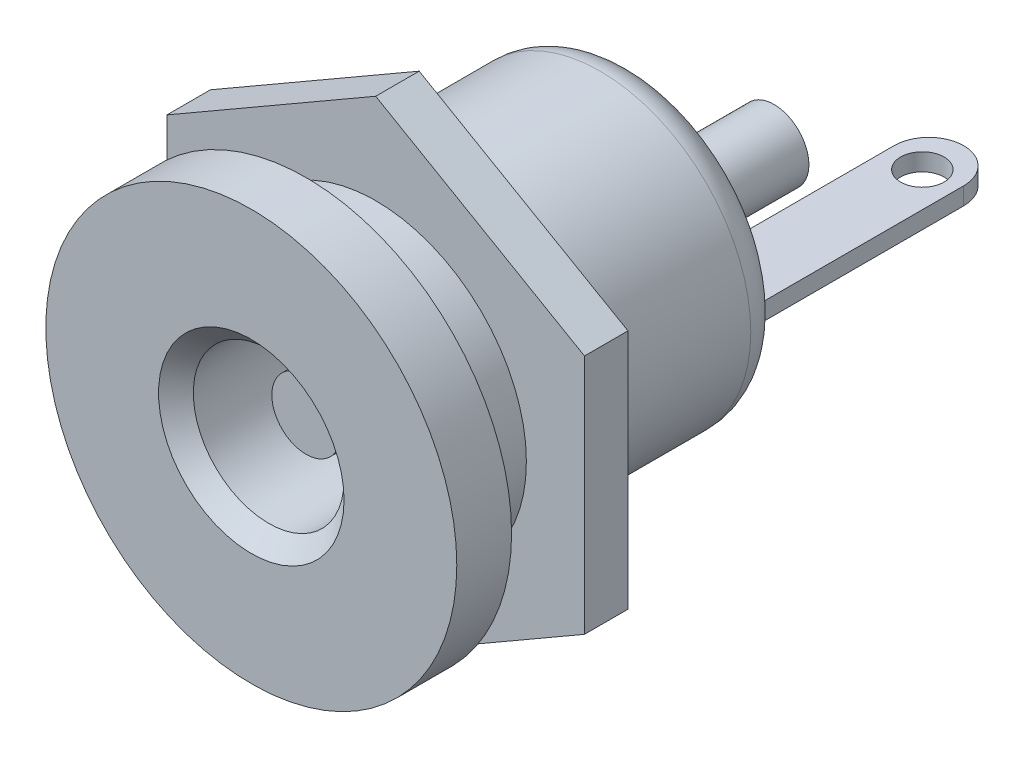
ISO-10303-21;
HEADER;
FILE_DESCRIPTION(('STEP AP214'),'2;1');
FILE_NAME('part.step','',(''),(''),'','','');
FILE_SCHEMA(('AUTOMOTIVE_DESIGN { 1 0 10303 214 1 1 1 1 }'));
ENDSEC;
DATA;
#1=APPLICATION_CONTEXT('core data for automotive mechanical design processes');
#2=APPLICATION_PROTOCOL_DEFINITION('international standard','automotive_design',2000,#1);
#3=PRODUCT_CONTEXT('',#1,'mechanical');
#4=PRODUCT('Part','Part','',(#3));
#5=PRODUCT_RELATED_PRODUCT_CATEGORY('part','',(#4));
#6=PRODUCT_DEFINITION_FORMATION('','',#4);
#7=PRODUCT_DEFINITION_CONTEXT('part definition',#1,'design');
#8=PRODUCT_DEFINITION('design','',#6,#7);
#9=PRODUCT_DEFINITION_SHAPE('','',#8);
#10=(LENGTH_UNIT() NAMED_UNIT(*) SI_UNIT(.MILLI.,.METRE.));
#11=(NAMED_UNIT(*) PLANE_ANGLE_UNIT() SI_UNIT($,.RADIAN.));
#12=(NAMED_UNIT(*) SI_UNIT($,.STERADIAN.) SOLID_ANGLE_UNIT());
#13=UNCERTAINTY_MEASURE_WITH_UNIT(LENGTH_MEASURE(1.E-05),#10,'distance_accuracy_value','');
#14=(GEOMETRIC_REPRESENTATION_CONTEXT(3) GLOBAL_UNCERTAINTY_ASSIGNED_CONTEXT((#13)) GLOBAL_UNIT_ASSIGNED_CONTEXT((#10,
#11,#12)) REPRESENTATION_CONTEXT('',''));
#15=CARTESIAN_POINT('',(0.,0.,0.));
#16=DIRECTION('',(0.,0.,1.));
#17=DIRECTION('',(1.,0.,0.));
#18=AXIS2_PLACEMENT_3D('',#15,#16,#17);
#19=CARTESIAN_POINT('',(0.,0.,2.));
#20=DIRECTION('',(0.,0.,1.));
#21=DIRECTION('',(1.,0.,0.));
#22=AXIS2_PLACEMENT_3D('',#19,#20,#21);
#23=PLANE('',#22);
#24=CARTESIAN_POINT('',(0.,0.,2.));
#25=DIRECTION('',(0.,0.,1.));
#26=DIRECTION('',(1.,0.,0.));
#27=AXIS2_PLACEMENT_3D('',#24,#25,#26);
#28=CIRCLE('',#27,3.38500000000001);
#29=CARTESIAN_POINT('',(3.38500000000001,0.,2.));
#30=VERTEX_POINT('',#29);
#31=EDGE_CURVE('E12',#30,#30,#28,.F.);
#32=ORIENTED_EDGE('',*,*,#31,.T.);
#33=EDGE_LOOP('',(#32));
#34=FACE_BOUND('',#33,.T.);
#35=CARTESIAN_POINT('',(0.,0.,2.));
#36=DIRECTION('',(0.,0.,1.));
#37=DIRECTION('',(1.,0.,0.));
#38=AXIS2_PLACEMENT_3D('',#35,#36,#37);
#39=CIRCLE('',#38,7.5);
#40=CARTESIAN_POINT('',(7.5,0.,2.));
#41=VERTEX_POINT('',#40);
#42=EDGE_CURVE('E272',#41,#41,#39,.T.);
#43=ORIENTED_EDGE('',*,*,#42,.T.);
#44=EDGE_LOOP('',(#43));
#45=FACE_BOUND('',#44,.T.);
#46=ADVANCED_FACE('F43',(#34,#45),#23,.T.);
#47=CARTESIAN_POINT('',(0.,0.,0.));
#48=DIRECTION('',(0.,0.,1.));
#49=DIRECTION('',(1.,0.,0.));
#50=AXIS2_PLACEMENT_3D('',#47,#48,#49);
#51=PLANE('',#50);
#52=CARTESIAN_POINT('',(0.,0.,0.));
#53=DIRECTION('',(0.,0.,-1.));
#54=DIRECTION('',(-1.,0.,0.));
#55=AXIS2_PLACEMENT_3D('',#52,#53,#54);
#56=CIRCLE('',#55,5.5);
#57=CARTESIAN_POINT('',(-5.5,0.,0.));
#58=VERTEX_POINT('',#57);
#59=EDGE_CURVE('E268',#58,#58,#56,.T.);
#60=ORIENTED_EDGE('',*,*,#59,.F.);
#61=EDGE_LOOP('',(#60));
#62=FACE_BOUND('',#61,.T.);
#63=CARTESIAN_POINT('',(0.,0.,0.));
#64=DIRECTION('',(0.,0.,1.));
#65=DIRECTION('',(1.,0.,0.));
#66=AXIS2_PLACEMENT_3D('',#63,#64,#65);
#67=CIRCLE('',#66,7.5);
#68=CARTESIAN_POINT('',(7.5,0.,0.));
#69=VERTEX_POINT('',#68);
#70=EDGE_CURVE('E262',#69,#69,#67,.T.);
#71=ORIENTED_EDGE('',*,*,#70,.F.);
#72=EDGE_LOOP('',(#71));
#73=FACE_BOUND('',#72,.T.);
#74=ADVANCED_FACE('F419',(#62,#73),#51,.F.);
#75=CARTESIAN_POINT('',(0.,0.,2.));
#76=DIRECTION('',(0.,0.,-1.));
#77=DIRECTION('',(-1.,0.,0.));
#78=AXIS2_PLACEMENT_3D('',#75,#76,#77);
#79=CYLINDRICAL_SURFACE('',#78,7.5);
#80=ORIENTED_EDGE('',*,*,#42,.F.);
#81=EDGE_LOOP('',(#80));
#82=FACE_BOUND('',#81,.T.);
#83=ORIENTED_EDGE('',*,*,#70,.T.);
#84=EDGE_LOOP('',(#83));
#85=FACE_BOUND('',#84,.T.);
#86=ADVANCED_FACE('F425',(#82,#85),#79,.T.);
#87=CARTESIAN_POINT('',(0.,0.,2.));
#88=DIRECTION('',(0.,0.,-1.));
#89=DIRECTION('',(-1.,0.,0.));
#90=AXIS2_PLACEMENT_3D('',#87,#88,#89);
#91=CYLINDRICAL_SURFACE('',#90,2.75);
#92=CARTESIAN_POINT('',(0.,0.,1.36499999999999));
#93=DIRECTION('',(0.,0.,1.));
#94=DIRECTION('',(1.,0.,0.));
#95=AXIS2_PLACEMENT_3D('',#92,#93,#94);
#96=CIRCLE('',#95,2.75);
#97=CARTESIAN_POINT('',(2.75,0.,1.36499999999999));
#98=VERTEX_POINT('',#97);
#99=EDGE_CURVE('E53',#98,#98,#96,.T.);
#100=ORIENTED_EDGE('',*,*,#99,.T.);
#101=EDGE_LOOP('',(#100));
#102=FACE_BOUND('',#101,.T.);
#103=CARTESIAN_POINT('',(0.,0.,-10.7));
#104=DIRECTION('',(0.,0.,1.));
#105=DIRECTION('',(1.,0.,0.));
#106=AXIS2_PLACEMENT_3D('',#103,#104,#105);
#107=CIRCLE('',#106,2.75);
#108=CARTESIAN_POINT('',(2.75,0.,-10.7));
#109=VERTEX_POINT('',#108);
#110=EDGE_CURVE('E177',#109,#109,#107,.T.);
#111=ORIENTED_EDGE('',*,*,#110,.F.);
#112=EDGE_LOOP('',(#111));
#113=FACE_BOUND('',#112,.T.);
#114=ADVANCED_FACE('F430',(#102,#113),#91,.F.);
#115=CARTESIAN_POINT('',(0.,0.,-12.));
#116=DIRECTION('',(0.,0.,1.));
#117=DIRECTION('',(1.,0.,0.));
#118=AXIS2_PLACEMENT_3D('',#115,#116,#117);
#119=CYLINDRICAL_SURFACE('',#118,5.5);
#120=CARTESIAN_POINT('',(0.,0.,-2.54));
#121=DIRECTION('',(0.,0.,1.));
#122=DIRECTION('',(1.,0.,0.));
#123=AXIS2_PLACEMENT_3D('',#120,#121,#122);
#124=CIRCLE('',#123,5.5);
#125=CARTESIAN_POINT('',(5.5,0.,-2.54));
#126=VERTEX_POINT('',#125);
#127=EDGE_CURVE('E211',#126,#126,#124,.T.);
#128=ORIENTED_EDGE('',*,*,#127,.T.);
#129=EDGE_LOOP('',(#128));
#130=FACE_BOUND('',#129,.T.);
#131=ORIENTED_EDGE('',*,*,#59,.T.);
#132=EDGE_LOOP('',(#131));
#133=FACE_BOUND('',#132,.T.);
#134=ADVANCED_FACE('F378',(#130,#133),#119,.T.);
#135=CARTESIAN_POINT('',(173740.878483019,100300.544143311,-4.1275));
#136=DIRECTION('',(0.5,-0.866025403784438,0.));
#137=DIRECTION('',(0.866025403784439,0.5,0.));
#138=AXIS2_PLACEMENT_3D('',#135,#136,#137);
#139=PLANE('',#138);
#140=DIRECTION('',(0.866025403784438,0.5,0.));
#141=VECTOR('',#140,1.);
#142=CARTESIAN_POINT('',(173740.878483019,100300.544143311,-2.54));
#143=LINE('',#142,#141);
#144=CARTESIAN_POINT('',(5.6843418860808E-11,-8.79881810243432,-2.54));
#145=VERTEX_POINT('',#144);
#146=CARTESIAN_POINT('',(7.61999999997443,-4.39940905124558,-2.54));
#147=VERTEX_POINT('',#146);
#148=EDGE_CURVE('E192',#145,#147,#143,.T.);
#149=ORIENTED_EDGE('',*,*,#148,.F.);
#150=DIRECTION('',(0.,0.,1.));
#151=VECTOR('',#150,1.);
#152=CARTESIAN_POINT('',(5.6843418860808E-11,-8.79881810243432,-4.1275));
#153=LINE('',#152,#151);
#154=CARTESIAN_POINT('',(5.6843418860808E-11,-8.79881810243432,-4.1275));
#155=VERTEX_POINT('',#154);
#156=EDGE_CURVE('E168',#155,#145,#153,.T.);
#157=ORIENTED_EDGE('',*,*,#156,.F.);
#158=DIRECTION('',(0.866025403784438,0.5,0.));
#159=VECTOR('',#158,1.);
#160=CARTESIAN_POINT('',(173740.878483019,100300.544143311,-4.1275));
#161=LINE('',#160,#159);
#162=CARTESIAN_POINT('',(7.61999999997443,-4.39940905124558,-4.1275));
#163=VERTEX_POINT('',#162);
#164=EDGE_CURVE('E160',#155,#163,#161,.T.);
#165=ORIENTED_EDGE('',*,*,#164,.T.);
#166=DIRECTION('',(0.,0.,1.));
#167=VECTOR('',#166,1.);
#168=CARTESIAN_POINT('',(7.61999999997443,-4.39940905124558,-4.1275));
#169=LINE('',#168,#167);
#170=EDGE_CURVE('E141',#163,#147,#169,.T.);
#171=ORIENTED_EDGE('',*,*,#170,.T.);
#172=EDGE_LOOP('',(#149,#157,#165,#171));
#173=FACE_BOUND('',#172,.T.);
#174=ADVANCED_FACE('F167',(#173),#139,.T.);
#175=CARTESIAN_POINT('',(426259.121516981,-246109.617370464,-4.1275));
#176=DIRECTION('',(-0.5,-0.866025403784439,0.));
#177=DIRECTION('',(0.866025403784439,-0.5,0.));
#178=AXIS2_PLACEMENT_3D('',#175,#176,#177);
#179=PLANE('',#178);
#180=DIRECTION('',(0.866025403784439,-0.5,0.));
#181=VECTOR('',#180,1.);
#182=CARTESIAN_POINT('',(426259.121516981,-246109.617370464,-2.54));
#183=LINE('',#182,#181);
#184=CARTESIAN_POINT('',(-7.61999999997443,-4.39940905118874,-2.54));
#185=VERTEX_POINT('',#184);
#186=EDGE_CURVE('E170',#185,#145,#183,.T.);
#187=ORIENTED_EDGE('',*,*,#186,.F.);
#188=DIRECTION('',(0.,0.,1.));
#189=VECTOR('',#188,1.);
#190=CARTESIAN_POINT('',(-7.61999999997443,-4.39940905118874,-4.1275));
#191=LINE('',#190,#189);
#192=CARTESIAN_POINT('',(-7.61999999997443,-4.39940905118874,-4.1275));
#193=VERTEX_POINT('',#192);
#194=EDGE_CURVE('E212',#193,#185,#191,.T.);
#195=ORIENTED_EDGE('',*,*,#194,.F.);
#196=DIRECTION('',(0.866025403784439,-0.5,0.));
#197=VECTOR('',#196,1.);
#198=CARTESIAN_POINT('',(426259.121516981,-246109.617370464,-4.1275));
#199=LINE('',#198,#197);
#200=EDGE_CURVE('E153',#193,#155,#199,.T.);
#201=ORIENTED_EDGE('',*,*,#200,.T.);
#202=ORIENTED_EDGE('',*,*,#156,.T.);
#203=EDGE_LOOP('',(#187,#195,#201,#202));
#204=FACE_BOUND('',#203,.T.);
#205=ADVANCED_FACE('F377',(#204),#179,.T.);
#206=CARTESIAN_POINT('',(-7.62000000003127,-291591.75,-4.1275));
#207=DIRECTION('',(-1.,0.,0.));
#208=DIRECTION('',(0.,-1.,0.));
#209=AXIS2_PLACEMENT_3D('',#206,#207,#208);
#210=PLANE('',#209);
#211=DIRECTION('',(0.,-1.,0.));
#212=VECTOR('',#211,1.);
#213=CARTESIAN_POINT('',(-7.62000000003127,-291591.75,-2.54));
#214=LINE('',#213,#212);
#215=CARTESIAN_POINT('',(-7.62000000000252,4.3994090511319,-2.54));
#216=VERTEX_POINT('',#215);
#217=EDGE_CURVE('E174',#216,#185,#214,.T.);
#218=ORIENTED_EDGE('',*,*,#217,.F.);
#219=DIRECTION('',(0.,0.,1.));
#220=VECTOR('',#219,1.);
#221=CARTESIAN_POINT('',(-7.62000000000252,4.3994090511319,-4.1275));
#222=LINE('',#221,#220);
#223=CARTESIAN_POINT('',(-7.62000000000252,4.3994090511319,-4.1275));
#224=VERTEX_POINT('',#223);
#225=EDGE_CURVE('E215',#224,#216,#222,.T.);
#226=ORIENTED_EDGE('',*,*,#225,.F.);
#227=DIRECTION('',(0.,-1.,0.));
#228=VECTOR('',#227,1.);
#229=CARTESIAN_POINT('',(-7.62000000003127,-291591.75,-4.1275));
#230=LINE('',#229,#228);
#231=EDGE_CURVE('E186',#224,#193,#230,.T.);
#232=ORIENTED_EDGE('',*,*,#231,.T.);
#233=ORIENTED_EDGE('',*,*,#194,.T.);
#234=EDGE_LOOP('',(#218,#226,#232,#233));
#235=FACE_BOUND('',#234,.T.);
#236=ADVANCED_FACE('F388',(#235),#210,.T.);
#237=CARTESIAN_POINT('',(173733.258483019,100313.742370465,-4.1275));
#238=DIRECTION('',(-0.5,0.866025403784439,0.));
#239=DIRECTION('',(-0.866025403784439,-0.5,0.));
#240=AXIS2_PLACEMENT_3D('',#237,#238,#239);
#241=PLANE('',#240);
#242=DIRECTION('',(-0.866025403784439,-0.5,0.));
#243=VECTOR('',#242,1.);
#244=CARTESIAN_POINT('',(173733.258483019,100313.742370465,-2.54));
#245=LINE('',#244,#243);
#246=CARTESIAN_POINT('',(-8.5265128291212E-11,8.79881810237748,-2.54));
#247=VERTEX_POINT('',#246);
#248=EDGE_CURVE('E202',#247,#216,#245,.T.);
#249=ORIENTED_EDGE('',*,*,#248,.F.);
#250=DIRECTION('',(0.,0.,1.));
#251=VECTOR('',#250,1.);
#252=CARTESIAN_POINT('',(-8.5265128291212E-11,8.79881810237748,-4.1275));
#253=LINE('',#252,#251);
#254=CARTESIAN_POINT('',(-8.5265128291212E-11,8.79881810237748,-4.1275));
#255=VERTEX_POINT('',#254);
#256=EDGE_CURVE('E218',#255,#247,#253,.T.);
#257=ORIENTED_EDGE('',*,*,#256,.F.);
#258=DIRECTION('',(-0.866025403784439,-0.5,0.));
#259=VECTOR('',#258,1.);
#260=CARTESIAN_POINT('',(173733.258483019,100313.742370465,-4.1275));
#261=LINE('',#260,#259);
#262=EDGE_CURVE('E182',#255,#224,#261,.T.);
#263=ORIENTED_EDGE('',*,*,#262,.T.);
#264=ORIENTED_EDGE('',*,*,#225,.T.);
#265=EDGE_LOOP('',(#249,#257,#263,#264));
#266=FACE_BOUND('',#265,.T.);
#267=ADVANCED_FACE('F384',(#266),#241,.T.);
#268=CARTESIAN_POINT('',(426266.741516981,-246096.419143311,-4.1275));
#269=DIRECTION('',(0.5,0.866025403784439,0.));
#270=DIRECTION('',(-0.866025403784439,0.5,0.));
#271=AXIS2_PLACEMENT_3D('',#268,#269,#270);
#272=PLANE('',#271);
#273=DIRECTION('',(-0.866025403784439,0.5,0.));
#274=VECTOR('',#273,1.);
#275=CARTESIAN_POINT('',(426266.741516981,-246096.419143311,-2.54));
#276=LINE('',#275,#274);
#277=CARTESIAN_POINT('',(7.61999999991758,4.39940905130243,-2.54));
#278=VERTEX_POINT('',#277);
#279=EDGE_CURVE('E198',#278,#247,#276,.T.);
#280=ORIENTED_EDGE('',*,*,#279,.F.);
#281=DIRECTION('',(0.,0.,1.));
#282=VECTOR('',#281,1.);
#283=CARTESIAN_POINT('',(7.61999999991758,4.39940905130243,-4.1275));
#284=LINE('',#283,#282);
#285=CARTESIAN_POINT('',(7.61999999991758,4.39940905130243,-4.1275));
#286=VERTEX_POINT('',#285);
#287=EDGE_CURVE('E152',#286,#278,#284,.T.);
#288=ORIENTED_EDGE('',*,*,#287,.F.);
#289=DIRECTION('',(-0.866025403784439,0.5,0.));
#290=VECTOR('',#289,1.);
#291=CARTESIAN_POINT('',(426266.741516981,-246096.419143311,-4.1275));
#292=LINE('',#291,#290);
#293=EDGE_CURVE('E164',#286,#255,#292,.T.);
#294=ORIENTED_EDGE('',*,*,#293,.T.);
#295=ORIENTED_EDGE('',*,*,#256,.T.);
#296=EDGE_LOOP('',(#280,#288,#294,#295));
#297=FACE_BOUND('',#296,.T.);
#298=ADVANCED_FACE('F381',(#297),#272,.T.);
#299=CARTESIAN_POINT('',(7.61999999997443,-291591.75,-4.1275));
#300=DIRECTION('',(1.,0.,0.));
#301=DIRECTION('',(0.,0.,-1.));
#302=AXIS2_PLACEMENT_3D('',#299,#300,#301);
#303=PLANE('',#302);
#304=DIRECTION('',(0.,1.,0.));
#305=VECTOR('',#304,1.);
#306=CARTESIAN_POINT('',(7.61999999997443,-291591.75,-2.54));
#307=LINE('',#306,#305);
#308=EDGE_CURVE('E146',#147,#278,#307,.T.);
#309=ORIENTED_EDGE('',*,*,#308,.F.);
#310=ORIENTED_EDGE('',*,*,#170,.F.);
#311=DIRECTION('',(0.,1.,0.));
#312=VECTOR('',#311,1.);
#313=CARTESIAN_POINT('',(7.61999999997443,-291591.75,-4.1275));
#314=LINE('',#313,#312);
#315=EDGE_CURVE('E144',#163,#286,#314,.T.);
#316=ORIENTED_EDGE('',*,*,#315,.T.);
#317=ORIENTED_EDGE('',*,*,#287,.T.);
#318=EDGE_LOOP('',(#309,#310,#316,#317));
#319=FACE_BOUND('',#318,.T.);
#320=ADVANCED_FACE('F143',(#319),#303,.T.);
#321=CARTESIAN_POINT('',(0.,0.,-4.1275));
#322=DIRECTION('',(0.,0.,1.));
#323=DIRECTION('',(1.,0.,0.));
#324=AXIS2_PLACEMENT_3D('',#321,#322,#323);
#325=PLANE('',#324);
#326=CARTESIAN_POINT('',(0.,0.,-4.1275));
#327=DIRECTION('',(0.,0.,1.));
#328=DIRECTION('',(1.,0.,0.));
#329=AXIS2_PLACEMENT_3D('',#326,#327,#328);
#330=CIRCLE('',#329,5.5);
#331=CARTESIAN_POINT('',(5.5,0.,-4.1275));
#332=VERTEX_POINT('',#331);
#333=EDGE_CURVE('E454',#332,#332,#330,.T.);
#334=ORIENTED_EDGE('',*,*,#333,.T.);
#335=EDGE_LOOP('',(#334));
#336=FACE_BOUND('',#335,.T.);
#337=ORIENTED_EDGE('',*,*,#164,.F.);
#338=ORIENTED_EDGE('',*,*,#200,.F.);
#339=ORIENTED_EDGE('',*,*,#231,.F.);
#340=ORIENTED_EDGE('',*,*,#262,.F.);
#341=ORIENTED_EDGE('',*,*,#293,.F.);
#342=ORIENTED_EDGE('',*,*,#315,.F.);
#343=EDGE_LOOP('',(#337,#338,#339,#340,#341,#342));
#344=FACE_BOUND('',#343,.T.);
#345=ADVANCED_FACE('F158',(#336,#344),#325,.F.);
#346=CARTESIAN_POINT('',(0.,0.,-2.54));
#347=DIRECTION('',(0.,0.,1.));
#348=DIRECTION('',(1.,0.,0.));
#349=AXIS2_PLACEMENT_3D('',#346,#347,#348);
#350=PLANE('',#349);
#351=ORIENTED_EDGE('',*,*,#127,.F.);
#352=EDGE_LOOP('',(#351));
#353=FACE_BOUND('',#352,.T.);
#354=ORIENTED_EDGE('',*,*,#148,.T.);
#355=ORIENTED_EDGE('',*,*,#308,.T.);
#356=ORIENTED_EDGE('',*,*,#279,.T.);
#357=ORIENTED_EDGE('',*,*,#248,.T.);
#358=ORIENTED_EDGE('',*,*,#217,.T.);
#359=ORIENTED_EDGE('',*,*,#186,.T.);
#360=EDGE_LOOP('',(#354,#355,#356,#357,#358,#359));
#361=FACE_BOUND('',#360,.T.);
#362=ADVANCED_FACE('F396',(#353,#361),#350,.T.);
#363=CARTESIAN_POINT('',(0.,0.,-17.08));
#364=DIRECTION('',(0.,0.,-1.));
#365=DIRECTION('',(-1.,0.,0.));
#366=AXIS2_PLACEMENT_3D('',#363,#364,#365);
#367=PLANE('',#366);
#368=CARTESIAN_POINT('',(0.,0.,-17.08));
#369=DIRECTION('',(0.,0.,-1.));
#370=DIRECTION('',(-1.,0.,0.));
#371=AXIS2_PLACEMENT_3D('',#368,#369,#370);
#372=CIRCLE('',#371,1.27);
#373=CARTESIAN_POINT('',(-1.27,0.,-17.08));
#374=VERTEX_POINT('',#373);
#375=EDGE_CURVE('E258',#374,#374,#372,.T.);
#376=ORIENTED_EDGE('',*,*,#375,.T.);
#377=EDGE_LOOP('',(#376));
#378=FACE_BOUND('',#377,.T.);
#379=ADVANCED_FACE('F373',(#378),#367,.T.);
#380=CARTESIAN_POINT('',(0.,-7.5,-22.4909247393764));
#381=DIRECTION('',(0.,1.,0.));
#382=DIRECTION('',(0.,0.,1.));
#383=AXIS2_PLACEMENT_3D('',#380,#381,#382);
#384=CYLINDRICAL_SURFACE('',#383,0.79375);
#385=CARTESIAN_POINT('',(0.,-3.4925,-22.4909247393764));
#386=DIRECTION('',(0.,1.,0.));
#387=DIRECTION('',(0.,0.,1.));
#388=AXIS2_PLACEMENT_3D('',#385,#386,#387);
#389=CIRCLE('',#388,0.79375);
#390=CARTESIAN_POINT('',(0.,-3.4925,-21.6971747393764));
#391=VERTEX_POINT('',#390);
#392=EDGE_CURVE('E223',#391,#391,#389,.T.);
#393=ORIENTED_EDGE('',*,*,#392,.T.);
#394=EDGE_LOOP('',(#393));
#395=FACE_BOUND('',#394,.T.);
#396=CARTESIAN_POINT('',(0.,-4.1275,-22.4909247393764));
#397=DIRECTION('',(0.,1.,0.));
#398=DIRECTION('',(0.,0.,1.));
#399=AXIS2_PLACEMENT_3D('',#396,#397,#398);
#400=CIRCLE('',#399,0.79375);
#401=CARTESIAN_POINT('',(0.,-4.1275,-21.6971747393764));
#402=VERTEX_POINT('',#401);
#403=EDGE_CURVE('E227',#402,#402,#400,.T.);
#404=ORIENTED_EDGE('',*,*,#403,.F.);
#405=EDGE_LOOP('',(#404));
#406=FACE_BOUND('',#405,.T.);
#407=ADVANCED_FACE('F369',(#395,#406),#384,.F.);
#408=CARTESIAN_POINT('',(0.,0.,-22.73));
#409=DIRECTION('',(0.,-1.,0.));
#410=DIRECTION('',(0.,0.,-1.));
#411=AXIS2_PLACEMENT_3D('',#408,#409,#410);
#412=CYLINDRICAL_SURFACE('',#411,1.27);
#413=CARTESIAN_POINT('',(0.,-4.1275,-22.73));
#414=DIRECTION('',(0.,1.,0.));
#415=DIRECTION('',(0.,0.,1.));
#416=AXIS2_PLACEMENT_3D('',#413,#414,#415);
#417=CIRCLE('',#416,1.27);
#418=CARTESIAN_POINT('',(-1.27,-4.1275,-22.73));
#419=VERTEX_POINT('',#418);
#420=CARTESIAN_POINT('',(0.,-4.1275,-24.));
#421=VERTEX_POINT('',#420);
#422=EDGE_CURVE('E290',#419,#421,#417,.F.);
#423=ORIENTED_EDGE('',*,*,#422,.F.);
#424=DIRECTION('',(0.,1.,0.));
#425=VECTOR('',#424,1.);
#426=CARTESIAN_POINT('',(-1.27,-4.1275,-22.73));
#427=LINE('',#426,#425);
#428=CARTESIAN_POINT('',(-1.27,-3.4925,-22.73));
#429=VERTEX_POINT('',#428);
#430=EDGE_CURVE('E284',#429,#419,#427,.F.);
#431=ORIENTED_EDGE('',*,*,#430,.F.);
#432=CARTESIAN_POINT('',(0.,-3.4925,-22.73));
#433=DIRECTION('',(0.,1.,0.));
#434=DIRECTION('',(-1.,0.,0.));
#435=AXIS2_PLACEMENT_3D('',#432,#433,#434);
#436=CIRCLE('',#435,1.27);
#437=CARTESIAN_POINT('',(0.,-3.4925,-24.));
#438=VERTEX_POINT('',#437);
#439=EDGE_CURVE('E281',#438,#429,#436,.T.);
#440=ORIENTED_EDGE('',*,*,#439,.F.);
#441=DIRECTION('',(0.,1.,0.));
#442=VECTOR('',#441,1.);
#443=CARTESIAN_POINT('',(0.,0.,-24.));
#444=LINE('',#443,#442);
#445=EDGE_CURVE('E228',#438,#421,#444,.F.);
#446=ORIENTED_EDGE('',*,*,#445,.T.);
#447=EDGE_LOOP('',(#423,#431,#440,#446));
#448=FACE_BOUND('',#447,.T.);
#449=ADVANCED_FACE('F372',(#448),#412,.T.);
#450=CARTESIAN_POINT('',(0.,0.,-17.08));
#451=DIRECTION('',(0.,0.,1.));
#452=DIRECTION('',(1.,0.,0.));
#453=AXIS2_PLACEMENT_3D('',#450,#451,#452);
#454=CYLINDRICAL_SURFACE('',#453,1.27);
#455=ORIENTED_EDGE('',*,*,#375,.F.);
#456=EDGE_LOOP('',(#455));
#457=FACE_BOUND('',#456,.T.);
#458=CARTESIAN_POINT('',(0.,0.,-12.));
#459=DIRECTION('',(0.,0.,-1.));
#460=DIRECTION('',(-1.,0.,0.));
#461=AXIS2_PLACEMENT_3D('',#458,#459,#460);
#462=CIRCLE('',#461,1.27);
#463=CARTESIAN_POINT('',(-1.27,0.,-12.));
#464=VERTEX_POINT('',#463);
#465=EDGE_CURVE('E263',#464,#464,#462,.T.);
#466=ORIENTED_EDGE('',*,*,#465,.T.);
#467=EDGE_LOOP('',(#466));
#468=FACE_BOUND('',#467,.T.);
#469=ADVANCED_FACE('F367',(#457,#468),#454,.T.);
#470=CARTESIAN_POINT('',(1.27,-3.4925,-52.6181720722672));
#471=DIRECTION('',(0.,1.,0.));
#472=DIRECTION('',(-1.,0.,0.));
#473=AXIS2_PLACEMENT_3D('',#470,#471,#472);
#474=PLANE('',#473);
#475=ORIENTED_EDGE('',*,*,#392,.F.);
#476=EDGE_LOOP('',(#475));
#477=FACE_BOUND('',#476,.T.);
#478=CARTESIAN_POINT('',(0.,-3.4925,-22.73));
#479=DIRECTION('',(0.,1.,0.));
#480=DIRECTION('',(-1.,0.,0.));
#481=AXIS2_PLACEMENT_3D('',#478,#479,#480);
#482=CIRCLE('',#481,1.27);
#483=CARTESIAN_POINT('',(1.27,-3.4925,-22.73));
#484=VERTEX_POINT('',#483);
#485=EDGE_CURVE('E267',#484,#438,#482,.T.);
#486=ORIENTED_EDGE('',*,*,#485,.T.);
#487=ORIENTED_EDGE('',*,*,#439,.T.);
#488=DIRECTION('',(0.,0.,1.));
#489=VECTOR('',#488,1.);
#490=CARTESIAN_POINT('',(-1.27,-3.4925,-52.6181720722672));
#491=LINE('',#490,#489);
#492=CARTESIAN_POINT('',(-1.27,-3.4925,-12.));
#493=VERTEX_POINT('',#492);
#494=EDGE_CURVE('E251',#429,#493,#491,.T.);
#495=ORIENTED_EDGE('',*,*,#494,.T.);
#496=DIRECTION('',(-1.,0.,0.));
#497=VECTOR('',#496,1.);
#498=CARTESIAN_POINT('',(1.27,-3.4925,-12.));
#499=LINE('',#498,#497);
#500=CARTESIAN_POINT('',(1.27,-3.4925,-12.));
#501=VERTEX_POINT('',#500);
#502=EDGE_CURVE('E244',#501,#493,#499,.T.);
#503=ORIENTED_EDGE('',*,*,#502,.F.);
#504=DIRECTION('',(0.,0.,1.));
#505=VECTOR('',#504,1.);
#506=CARTESIAN_POINT('',(1.27,-3.4925,-52.6181720722672));
#507=LINE('',#506,#505);
#508=EDGE_CURVE('E248',#484,#501,#507,.T.);
#509=ORIENTED_EDGE('',*,*,#508,.F.);
#510=EDGE_LOOP('',(#486,#487,#495,#503,#509));
#511=FACE_BOUND('',#510,.T.);
#512=ADVANCED_FACE('F364',(#477,#511),#474,.T.);
#513=CARTESIAN_POINT('',(0.,-3.4925,-22.73));
#514=DIRECTION('',(0.,1.,0.));
#515=DIRECTION('',(-1.,0.,0.));
#516=AXIS2_PLACEMENT_3D('',#513,#514,#515);
#517=CYLINDRICAL_SURFACE('',#516,1.27);
#518=DIRECTION('',(0.,1.,0.));
#519=VECTOR('',#518,1.);
#520=CARTESIAN_POINT('',(1.27,-3.4925,-22.73));
#521=LINE('',#520,#519);
#522=CARTESIAN_POINT('',(1.27,-4.1275,-22.73));
#523=VERTEX_POINT('',#522);
#524=EDGE_CURVE('E293',#523,#484,#521,.T.);
#525=ORIENTED_EDGE('',*,*,#524,.F.);
#526=CARTESIAN_POINT('',(0.,-4.1275,-22.73));
#527=DIRECTION('',(0.,1.,0.));
#528=DIRECTION('',(0.,0.,1.));
#529=AXIS2_PLACEMENT_3D('',#526,#527,#528);
#530=CIRCLE('',#529,1.27);
#531=EDGE_CURVE('E287',#421,#523,#530,.F.);
#532=ORIENTED_EDGE('',*,*,#531,.F.);
#533=ORIENTED_EDGE('',*,*,#445,.F.);
#534=ORIENTED_EDGE('',*,*,#485,.F.);
#535=EDGE_LOOP('',(#525,#532,#533,#534));
#536=FACE_BOUND('',#535,.T.);
#537=ADVANCED_FACE('F334',(#536),#517,.T.);
#538=CARTESIAN_POINT('',(0.,0.,-12.));
#539=DIRECTION('',(0.,0.,-1.));
#540=DIRECTION('',(-1.,0.,0.));
#541=AXIS2_PLACEMENT_3D('',#538,#539,#540);
#542=PLANE('',#541);
#543=DIRECTION('',(-1.,0.,0.));
#544=VECTOR('',#543,1.);
#545=CARTESIAN_POINT('',(1.27,-4.1275,-12.));
#546=LINE('',#545,#544);
#547=CARTESIAN_POINT('',(0.925550511857674,-4.1275,-12.));
#548=VERTEX_POINT('',#547);
#549=CARTESIAN_POINT('',(-0.925550511857674,-4.1275,-12.));
#550=VERTEX_POINT('',#549);
#551=EDGE_CURVE('E236',#548,#550,#546,.T.);
#552=ORIENTED_EDGE('',*,*,#551,.F.);
#553=CARTESIAN_POINT('',(0.,0.,-12.));
#554=DIRECTION('',(0.,0.,-1.));
#555=DIRECTION('',(-1.,0.,0.));
#556=AXIS2_PLACEMENT_3D('',#553,#554,#555);
#557=CIRCLE('',#556,4.23);
#558=EDGE_CURVE('E296',#548,#550,#557,.T.);
#559=ORIENTED_EDGE('',*,*,#558,.T.);
#560=EDGE_LOOP('',(#552,#559));
#561=FACE_BOUND('',#560,.T.);
#562=ADVANCED_FACE('F357',(#561),#542,.T.);
#563=CARTESIAN_POINT('',(1.27,-4.1275,-52.6181720722672));
#564=DIRECTION('',(0.,1.,0.));
#565=DIRECTION('',(0.,0.,1.));
#566=AXIS2_PLACEMENT_3D('',#563,#564,#565);
#567=PLANE('',#566);
#568=ORIENTED_EDGE('',*,*,#403,.T.);
#569=EDGE_LOOP('',(#568));
#570=FACE_BOUND('',#569,.T.);
#571=DIRECTION('',(0.,0.,1.));
#572=VECTOR('',#571,1.);
#573=CARTESIAN_POINT('',(-1.27,-4.1275,-52.6181720722672));
#574=LINE('',#573,#572);
#575=CARTESIAN_POINT('',(-1.27,-4.1275,-11.9969149971442));
#576=VERTEX_POINT('',#575);
#577=EDGE_CURVE('E60',#419,#576,#574,.T.);
#578=ORIENTED_EDGE('',*,*,#577,.F.);
#579=ORIENTED_EDGE('',*,*,#422,.T.);
#580=ORIENTED_EDGE('',*,*,#531,.T.);
#581=DIRECTION('',(0.,0.,1.));
#582=VECTOR('',#581,1.);
#583=CARTESIAN_POINT('',(1.27,-4.1275,-52.6181720722672));
#584=LINE('',#583,#582);
#585=CARTESIAN_POINT('',(1.27,-4.1275,-11.9969149971442));
#586=VERTEX_POINT('',#585);
#587=EDGE_CURVE('E68',#523,#586,#584,.T.);
#588=ORIENTED_EDGE('',*,*,#587,.T.);
#589=CARTESIAN_POINT('',(1.27,-4.1275,-11.9969149971442));
#590=CARTESIAN_POINT('',(1.24129963272936,-4.1275,-11.9975041097837));
#591=CARTESIAN_POINT('',(1.21259736079023,-4.1275,-11.9979907862374));
#592=CARTESIAN_POINT('',(1.15519110421312,-4.1275,-11.9987887104602));
#593=CARTESIAN_POINT('',(1.12648711964012,-4.1275,-11.9990999628467));
#594=CARTESIAN_POINT('',(1.06907828620464,-4.1275,-11.9995765083531));
#595=CARTESIAN_POINT('',(1.04037343735249,-4.1275,-11.9997418028096));
#596=CARTESIAN_POINT('',(0.98296252749865,-4.1275,-11.999953405039));
#597=CARTESIAN_POINT('',(0.954256466484945,-4.1275,-11.9999997096825));
#598=CARTESIAN_POINT('',(0.925550511857674,-4.1275,-12.));
#599=B_SPLINE_CURVE_WITH_KNOTS('',3,(#589,#590,#591,#592,#593,#594,#595,#596,#597,#598),
.UNSPECIFIED.,.F.,.F.,(4,2,2,2,4),(0.,0.0861187735719199,0.172235280238318,0.258350998260527,
0.34446898114794),.UNSPECIFIED.);
#600=EDGE_CURVE('E318',#586,#548,#599,.T.);
#601=ORIENTED_EDGE('',*,*,#600,.T.);
#602=ORIENTED_EDGE('',*,*,#551,.T.);
#603=CARTESIAN_POINT('',(-0.925550511857674,-4.1275,-12.));
#604=CARTESIAN_POINT('',(-0.954256466484945,-4.1275,-11.9999997096825));
#605=CARTESIAN_POINT('',(-0.98296252749865,-4.1275,-11.999953405039));
#606=CARTESIAN_POINT('',(-1.04037343735249,-4.1275,-11.9997418028096));
#607=CARTESIAN_POINT('',(-1.06907828620464,-4.1275,-11.9995765083531));
#608=CARTESIAN_POINT('',(-1.12648711964012,-4.1275,-11.9990999628467));
#609=CARTESIAN_POINT('',(-1.15519110421312,-4.1275,-11.9987887104602));
#610=CARTESIAN_POINT('',(-1.21259736079023,-4.1275,-11.9979907862374));
#611=CARTESIAN_POINT('',(-1.24129963272936,-4.1275,-11.9975041097837));
#612=CARTESIAN_POINT('',(-1.27,-4.1275,-11.9969149971442));
#613=B_SPLINE_CURVE_WITH_KNOTS('',3,(#603,#604,#605,#606,#607,#608,#609,#610,#611,#612),
.UNSPECIFIED.,.F.,.F.,(4,2,2,2,4),(0.,0.0861179828874133,0.172233700909622,0.25835020757602,
0.34446898114794),.UNSPECIFIED.);
#614=EDGE_CURVE('E340',#550,#576,#613,.T.);
#615=ORIENTED_EDGE('',*,*,#614,.T.);
#616=EDGE_LOOP('',(#578,#579,#580,#588,#601,#602,#615));
#617=FACE_BOUND('',#616,.T.);
#618=ADVANCED_FACE('F353',(#570,#617),#567,.F.);
#619=CARTESIAN_POINT('',(-1.27,-3.4925,-52.6181720722672));
#620=DIRECTION('',(-1.,0.,0.));
#621=DIRECTION('',(0.,0.,1.));
#622=AXIS2_PLACEMENT_3D('',#619,#620,#621);
#623=PLANE('',#622);
#624=ORIENTED_EDGE('',*,*,#494,.F.);
#625=ORIENTED_EDGE('',*,*,#430,.T.);
#626=ORIENTED_EDGE('',*,*,#577,.T.);
#627=CARTESIAN_POINT('',(-1.27,-4.1275,-11.9969149971442));
#628=CARTESIAN_POINT('',(-1.27,-4.11207516301201,-11.9979437452246));
#629=CARTESIAN_POINT('',(-1.27,-4.09664175909143,-11.9987152028361));
#630=CARTESIAN_POINT('',(-1.27,-4.06575782587081,-11.9997435368386));
#631=CARTESIAN_POINT('',(-1.27,-4.0503072965802,-12.0000004135124));
#632=CARTESIAN_POINT('',(-1.27,-4.0348482003664,-12.));
#633=B_SPLINE_CURVE_WITH_KNOTS('',3,(#627,#628,#629,#630,#631,#632),.UNSPECIFIED.,.F.,.F.,(4,2,
4),(0.,0.0463580190560366,0.0927160126372002),.UNSPECIFIED.);
#634=CARTESIAN_POINT('',(-1.27,-4.0348482003664,-12.));
#635=VERTEX_POINT('',#634);
#636=EDGE_CURVE('E346',#576,#635,#633,.T.);
#637=ORIENTED_EDGE('',*,*,#636,.T.);
#638=DIRECTION('',(0.,-1.,0.));
#639=VECTOR('',#638,1.);
#640=CARTESIAN_POINT('',(-1.27,-3.4925,-12.));
#641=LINE('',#640,#639);
#642=EDGE_CURVE('E240',#493,#635,#641,.T.);
#643=ORIENTED_EDGE('',*,*,#642,.F.);
#644=EDGE_LOOP('',(#624,#625,#626,#637,#643));
#645=FACE_BOUND('',#644,.T.);
#646=ADVANCED_FACE('F356',(#645),#623,.T.);
#647=ORIENTED_EDGE('',*,*,#465,.F.);
#648=EDGE_LOOP('',(#647));
#649=FACE_BOUND('',#648,.T.);
#650=ORIENTED_EDGE('',*,*,#642,.T.);
#651=CARTESIAN_POINT('',(0.,0.,-12.));
#652=DIRECTION('',(0.,0.,-1.));
#653=DIRECTION('',(-1.,0.,0.));
#654=AXIS2_PLACEMENT_3D('',#651,#652,#653);
#655=CIRCLE('',#654,4.23);
#656=CARTESIAN_POINT('',(1.27,-4.0348482003664,-12.));
#657=VERTEX_POINT('',#656);
#658=EDGE_CURVE('E302',#635,#657,#655,.T.);
#659=ORIENTED_EDGE('',*,*,#658,.T.);
#660=DIRECTION('',(0.,-1.,0.));
#661=VECTOR('',#660,1.);
#662=CARTESIAN_POINT('',(1.27,-3.4925,-12.));
#663=LINE('',#662,#661);
#664=EDGE_CURVE('E232',#501,#657,#663,.T.);
#665=ORIENTED_EDGE('',*,*,#664,.F.);
#666=ORIENTED_EDGE('',*,*,#502,.T.);
#667=EDGE_LOOP('',(#650,#659,#665,#666));
#668=FACE_BOUND('',#667,.T.);
#669=ADVANCED_FACE('F363',(#649,#668),#542,.T.);
#670=CARTESIAN_POINT('',(1.27,-3.4925,-52.6181720722672));
#671=DIRECTION('',(-1.,0.,0.));
#672=DIRECTION('',(0.,-1.,0.));
#673=AXIS2_PLACEMENT_3D('',#670,#671,#672);
#674=PLANE('',#673);
#675=ORIENTED_EDGE('',*,*,#587,.F.);
#676=ORIENTED_EDGE('',*,*,#524,.T.);
#677=ORIENTED_EDGE('',*,*,#508,.T.);
#678=ORIENTED_EDGE('',*,*,#664,.T.);
#679=CARTESIAN_POINT('',(1.27,-4.0348482003664,-12.));
#680=CARTESIAN_POINT('',(1.27,-4.0503072965802,-12.0000004135124));
#681=CARTESIAN_POINT('',(1.27,-4.06575782587081,-11.9997435368386));
#682=CARTESIAN_POINT('',(1.27,-4.09664175909143,-11.9987152028361));
#683=CARTESIAN_POINT('',(1.27,-4.11207516301201,-11.9979437452246));
#684=CARTESIAN_POINT('',(1.27,-4.1275,-11.9969149971442));
#685=B_SPLINE_CURVE_WITH_KNOTS('',3,(#679,#680,#681,#682,#683,#684),.UNSPECIFIED.,.F.,.F.,(4,2,
4),(0.,0.0463579935811636,0.0927160126372002),.UNSPECIFIED.);
#686=EDGE_CURVE('E310',#657,#586,#685,.T.);
#687=ORIENTED_EDGE('',*,*,#686,.T.);
#688=EDGE_LOOP('',(#675,#676,#677,#678,#687));
#689=FACE_BOUND('',#688,.T.);
#690=ADVANCED_FACE('F325',(#689),#674,.F.);
#691=CARTESIAN_POINT('',(0.,0.,-10.73));
#692=DIRECTION('',(0.,0.,-1.));
#693=DIRECTION('',(-1.,0.,0.));
#694=AXIS2_PLACEMENT_3D('',#691,#692,#693);
#695=TOROIDAL_SURFACE('',#694,4.23,1.27);
#696=CARTESIAN_POINT('',(0.,0.,-10.73));
#697=DIRECTION('',(0.,0.,-1.));
#698=DIRECTION('',(-1.,0.,0.));
#699=AXIS2_PLACEMENT_3D('',#696,#697,#698);
#700=CIRCLE('',#699,5.5);
#701=CARTESIAN_POINT('',(-5.5,0.,-10.73));
#702=VERTEX_POINT('',#701);
#703=EDGE_CURVE('E306',#702,#702,#700,.F.);
#704=ORIENTED_EDGE('',*,*,#703,.F.);
#705=EDGE_LOOP('',(#704));
#706=FACE_BOUND('',#705,.T.);
#707=ORIENTED_EDGE('',*,*,#686,.F.);
#708=ORIENTED_EDGE('',*,*,#658,.F.);
#709=ORIENTED_EDGE('',*,*,#636,.F.);
#710=ORIENTED_EDGE('',*,*,#614,.F.);
#711=ORIENTED_EDGE('',*,*,#558,.F.);
#712=ORIENTED_EDGE('',*,*,#600,.F.);
#713=EDGE_LOOP('',(#707,#708,#709,#710,#711,#712));
#714=FACE_BOUND('',#713,.T.);
#715=ADVANCED_FACE('F328',(#706,#714),#695,.T.);
#716=ORIENTED_EDGE('',*,*,#703,.T.);
#717=EDGE_LOOP('',(#716));
#718=FACE_BOUND('',#717,.T.);
#719=ORIENTED_EDGE('',*,*,#333,.F.);
#720=EDGE_LOOP('',(#719));
#721=FACE_BOUND('',#720,.T.);
#722=ADVANCED_FACE('F332',(#718,#721),#119,.T.);
#723=CARTESIAN_POINT('',(0.,0.,-10.7));
#724=DIRECTION('',(0.,0.,1.));
#725=DIRECTION('',(1.,0.,0.));
#726=AXIS2_PLACEMENT_3D('',#723,#724,#725);
#727=CYLINDRICAL_SURFACE('',#726,1.25);
#728=CARTESIAN_POINT('',(0.,0.,-10.7));
#729=DIRECTION('',(0.,0.,1.));
#730=DIRECTION('',(1.,0.,0.));
#731=AXIS2_PLACEMENT_3D('',#728,#729,#730);
#732=CIRCLE('',#731,1.25);
#733=CARTESIAN_POINT('',(1.25,0.,-10.7));
#734=VERTEX_POINT('',#733);
#735=EDGE_CURVE('E467',#734,#734,#732,.T.);
#736=ORIENTED_EDGE('',*,*,#735,.T.);
#737=EDGE_LOOP('',(#736));
#738=FACE_BOUND('',#737,.T.);
#739=CARTESIAN_POINT('',(0.,0.,0.));
#740=DIRECTION('',(0.,0.,-1.));
#741=DIRECTION('',(-1.,0.,0.));
#742=AXIS2_PLACEMENT_3D('',#739,#740,#741);
#743=CIRCLE('',#742,1.25);
#744=CARTESIAN_POINT('',(-1.25,0.,0.));
#745=VERTEX_POINT('',#744);
#746=EDGE_CURVE('E195',#745,#745,#743,.T.);
#747=ORIENTED_EDGE('',*,*,#746,.T.);
#748=EDGE_LOOP('',(#747));
#749=FACE_BOUND('',#748,.T.);
#750=ADVANCED_FACE('F407',(#738,#749),#727,.T.);
#751=CARTESIAN_POINT('',(0.,0.,-10.7));
#752=DIRECTION('',(0.,0.,1.));
#753=DIRECTION('',(1.,0.,0.));
#754=AXIS2_PLACEMENT_3D('',#751,#752,#753);
#755=PLANE('',#754);
#756=ORIENTED_EDGE('',*,*,#735,.F.);
#757=EDGE_LOOP('',(#756));
#758=FACE_BOUND('',#757,.T.);
#759=ORIENTED_EDGE('',*,*,#110,.T.);
#760=EDGE_LOOP('',(#759));
#761=FACE_BOUND('',#760,.T.);
#762=ADVANCED_FACE('F403',(#758,#761),#755,.T.);
#763=CARTESIAN_POINT('',(0.,0.,0.));
#764=DIRECTION('',(0.,0.,-1.));
#765=DIRECTION('',(-1.,0.,0.));
#766=AXIS2_PLACEMENT_3D('',#763,#764,#765);
#767=PLANE('',#766);
#768=ORIENTED_EDGE('',*,*,#746,.F.);
#769=EDGE_LOOP('',(#768));
#770=FACE_BOUND('',#769,.T.);
#771=ADVANCED_FACE('F406',(#770),#767,.F.);
#772=CARTESIAN_POINT('',(0.,0.,1.36499999999999));
#773=DIRECTION('',(0.,0.,1.));
#774=DIRECTION('',(1.,0.,0.));
#775=AXIS2_PLACEMENT_3D('',#772,#773,#774);
#776=CONICAL_SURFACE('',#775,2.75,0.785398163397449);
#777=ORIENTED_EDGE('',*,*,#31,.F.);
#778=EDGE_LOOP('',(#777));
#779=FACE_BOUND('',#778,.T.);
#780=ORIENTED_EDGE('',*,*,#99,.F.);
#781=EDGE_LOOP('',(#780));
#782=FACE_BOUND('',#781,.T.);
#783=ADVANCED_FACE('F46',(#779,#782),#776,.F.);
#784=CLOSED_SHELL('',(#46,#74,#86,#114,#134,#174,#205,#236,#267,#298,#320,#345,#362,#379,#407,
#449,#469,#512,#537,#562,#618,#646,#669,#690,#715,#722,#750,#762,#771,#783));
#785=MANIFOLD_SOLID_BREP('B2',#784);
#786=ADVANCED_BREP_SHAPE_REPRESENTATION('',(#18,#785),#14);
#787=SHAPE_DEFINITION_REPRESENTATION(#9,#786);
ENDSEC;
END-ISO-10303-21;
